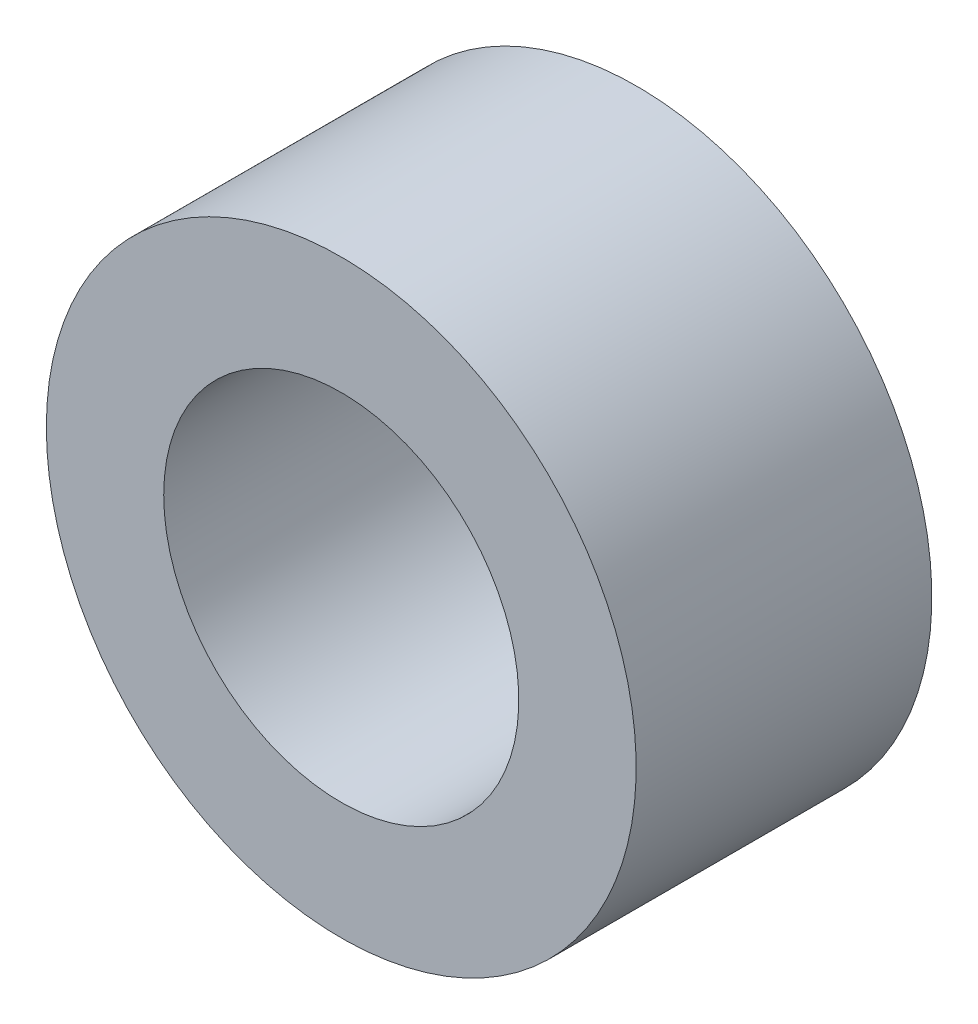
ISO-10303-21;
HEADER;
FILE_DESCRIPTION(('STEP AP214'),'2;1');
FILE_NAME('part.step','',(''),(''),'','','');
FILE_SCHEMA(('AUTOMOTIVE_DESIGN { 1 0 10303 214 1 1 1 1 }'));
ENDSEC;
DATA;
#1=APPLICATION_CONTEXT('core data for automotive mechanical design processes');
#2=APPLICATION_PROTOCOL_DEFINITION('international standard','automotive_design',2000,#1);
#3=PRODUCT_CONTEXT('',#1,'mechanical');
#4=PRODUCT('Part','Part','',(#3));
#5=PRODUCT_RELATED_PRODUCT_CATEGORY('part','',(#4));
#6=PRODUCT_DEFINITION_FORMATION('','',#4);
#7=PRODUCT_DEFINITION_CONTEXT('part definition',#1,'design');
#8=PRODUCT_DEFINITION('design','',#6,#7);
#9=PRODUCT_DEFINITION_SHAPE('','',#8);
#10=(LENGTH_UNIT() NAMED_UNIT(*) SI_UNIT(.MILLI.,.METRE.));
#11=(NAMED_UNIT(*) PLANE_ANGLE_UNIT() SI_UNIT($,.RADIAN.));
#12=(NAMED_UNIT(*) SI_UNIT($,.STERADIAN.) SOLID_ANGLE_UNIT());
#13=UNCERTAINTY_MEASURE_WITH_UNIT(LENGTH_MEASURE(1.E-05),#10,'distance_accuracy_value','');
#14=(GEOMETRIC_REPRESENTATION_CONTEXT(3) GLOBAL_UNCERTAINTY_ASSIGNED_CONTEXT((#13)) GLOBAL_UNIT_ASSIGNED_CONTEXT((#10,
#11,#12)) REPRESENTATION_CONTEXT('',''));
#15=CARTESIAN_POINT('',(0.,0.,0.));
#16=DIRECTION('',(0.,0.,1.));
#17=DIRECTION('',(1.,0.,0.));
#18=AXIS2_PLACEMENT_3D('',#15,#16,#17);
#19=CARTESIAN_POINT('',(0.,0.,15.));
#20=DIRECTION('',(0.,0.,-1.));
#21=DIRECTION('',(0.,-1.,0.));
#22=AXIS2_PLACEMENT_3D('',#19,#20,#21);
#23=PLANE('',#22);
#24=CARTESIAN_POINT('',(0.,0.,15.));
#25=DIRECTION('',(0.,0.,1.));
#26=DIRECTION('',(1.,0.,0.));
#27=AXIS2_PLACEMENT_3D('',#24,#25,#26);
#28=CIRCLE('',#27,6.005);
#29=CARTESIAN_POINT('',(-6.005,0.,15.));
#30=VERTEX_POINT('',#29);
#31=EDGE_CURVE('E59',#30,#30,#28,.T.);
#32=ORIENTED_EDGE('',*,*,#31,.F.);
#33=EDGE_LOOP('',(#32));
#34=FACE_BOUND('',#33,.T.);
#35=CARTESIAN_POINT('',(0.,0.,15.));
#36=DIRECTION('',(0.,0.,-1.));
#37=DIRECTION('',(1.,0.,0.));
#38=AXIS2_PLACEMENT_3D('',#35,#36,#37);
#39=CIRCLE('',#38,9.975);
#40=CARTESIAN_POINT('',(-9.975,0.,15.));
#41=VERTEX_POINT('',#40);
#42=EDGE_CURVE('E11',#41,#41,#39,.T.);
#43=ORIENTED_EDGE('',*,*,#42,.F.);
#44=EDGE_LOOP('',(#43));
#45=FACE_BOUND('',#44,.T.);
#46=ADVANCED_FACE('F17',(#34,#45),#23,.F.);
#47=CARTESIAN_POINT('',(0.,0.,5.));
#48=DIRECTION('',(0.,0.,-1.));
#49=DIRECTION('',(0.,-1.,0.));
#50=AXIS2_PLACEMENT_3D('',#47,#48,#49);
#51=PLANE('',#50);
#52=CARTESIAN_POINT('',(0.,0.,5.));
#53=DIRECTION('',(0.,0.,1.));
#54=DIRECTION('',(1.,0.,0.));
#55=AXIS2_PLACEMENT_3D('',#52,#53,#54);
#56=CIRCLE('',#55,6.005);
#57=CARTESIAN_POINT('',(-6.005,0.,5.));
#58=VERTEX_POINT('',#57);
#59=EDGE_CURVE('E57',#58,#58,#56,.T.);
#60=ORIENTED_EDGE('',*,*,#59,.T.);
#61=EDGE_LOOP('',(#60));
#62=FACE_BOUND('',#61,.T.);
#63=CARTESIAN_POINT('',(0.,0.,5.));
#64=DIRECTION('',(0.,0.,-1.));
#65=DIRECTION('',(1.,0.,0.));
#66=AXIS2_PLACEMENT_3D('',#63,#64,#65);
#67=CIRCLE('',#66,9.975);
#68=CARTESIAN_POINT('',(-9.975,0.,5.));
#69=VERTEX_POINT('',#68);
#70=EDGE_CURVE('E69',#69,#69,#67,.T.);
#71=ORIENTED_EDGE('',*,*,#70,.T.);
#72=EDGE_LOOP('',(#71));
#73=FACE_BOUND('',#72,.T.);
#74=ADVANCED_FACE('F19',(#62,#73),#51,.T.);
#75=CARTESIAN_POINT('',(0.,0.,15.));
#76=DIRECTION('',(0.,0.,-1.));
#77=DIRECTION('',(1.,0.,0.));
#78=AXIS2_PLACEMENT_3D('',#75,#76,#77);
#79=CYLINDRICAL_SURFACE('',#78,9.975);
#80=ORIENTED_EDGE('',*,*,#70,.F.);
#81=DIRECTION('',(0.,0.,1.));
#82=VECTOR('',#81,1.);
#83=CARTESIAN_POINT('',(-9.975,0.,15.));
#84=LINE('',#83,#82);
#85=EDGE_CURVE('E21',#69,#41,#84,.T.);
#86=ORIENTED_EDGE('',*,*,#85,.T.);
#87=ORIENTED_EDGE('',*,*,#42,.T.);
#88=ORIENTED_EDGE('',*,*,#85,.F.);
#89=EDGE_LOOP('',(#80,#86,#87,#88));
#90=FACE_BOUND('',#89,.T.);
#91=ADVANCED_FACE('F77',(#90),#79,.T.);
#92=CARTESIAN_POINT('',(0.,0.,15.));
#93=DIRECTION('',(0.,0.,-1.));
#94=DIRECTION('',(1.,0.,0.));
#95=AXIS2_PLACEMENT_3D('',#92,#93,#94);
#96=CYLINDRICAL_SURFACE('',#95,6.005);
#97=ORIENTED_EDGE('',*,*,#59,.F.);
#98=DIRECTION('',(0.,0.,1.));
#99=VECTOR('',#98,1.);
#100=CARTESIAN_POINT('',(-6.005,0.,15.));
#101=LINE('',#100,#99);
#102=EDGE_CURVE('E52',#58,#30,#101,.T.);
#103=ORIENTED_EDGE('',*,*,#102,.T.);
#104=ORIENTED_EDGE('',*,*,#31,.T.);
#105=ORIENTED_EDGE('',*,*,#102,.F.);
#106=EDGE_LOOP('',(#97,#103,#104,#105));
#107=FACE_BOUND('',#106,.T.);
#108=ADVANCED_FACE('F54',(#107),#96,.F.);
#109=CLOSED_SHELL('',(#46,#74,#91,#108));
#110=MANIFOLD_SOLID_BREP('B1',#109);
#111=ADVANCED_BREP_SHAPE_REPRESENTATION('',(#18,#110),#14);
#112=SHAPE_DEFINITION_REPRESENTATION(#9,#111);
ENDSEC;
END-ISO-10303-21;
